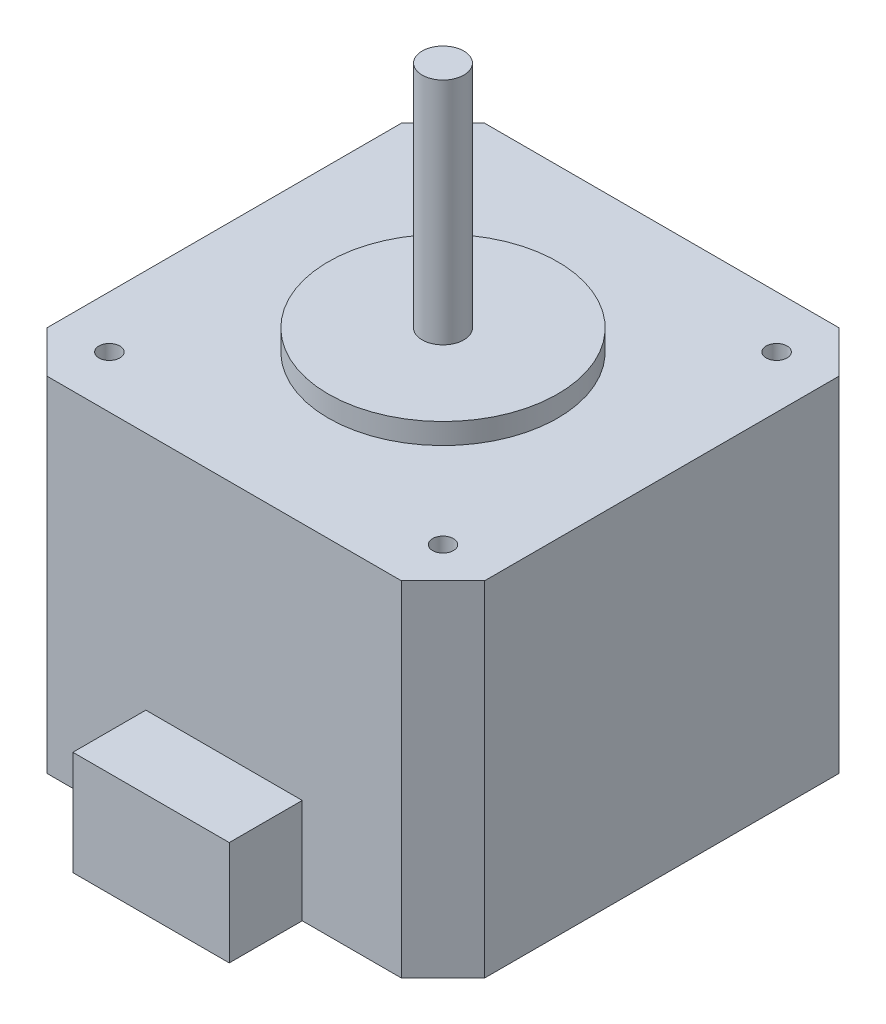
ISO-10303-21;
HEADER;
FILE_DESCRIPTION(('STEP AP214'),'2;1');
FILE_NAME('part.step','',(''),(''),'','','');
FILE_SCHEMA(('AUTOMOTIVE_DESIGN { 1 0 10303 214 1 1 1 1 }'));
ENDSEC;
DATA;
#1=APPLICATION_CONTEXT('core data for automotive mechanical design processes');
#2=APPLICATION_PROTOCOL_DEFINITION('international standard','automotive_design',2000,#1);
#3=PRODUCT_CONTEXT('',#1,'mechanical');
#4=PRODUCT('Part','Part','',(#3));
#5=PRODUCT_RELATED_PRODUCT_CATEGORY('part','',(#4));
#6=PRODUCT_DEFINITION_FORMATION('','',#4);
#7=PRODUCT_DEFINITION_CONTEXT('part definition',#1,'design');
#8=PRODUCT_DEFINITION('design','',#6,#7);
#9=PRODUCT_DEFINITION_SHAPE('','',#8);
#10=(LENGTH_UNIT() NAMED_UNIT(*) SI_UNIT(.MILLI.,.METRE.));
#11=(NAMED_UNIT(*) PLANE_ANGLE_UNIT() SI_UNIT($,.RADIAN.));
#12=(NAMED_UNIT(*) SI_UNIT($,.STERADIAN.) SOLID_ANGLE_UNIT());
#13=UNCERTAINTY_MEASURE_WITH_UNIT(LENGTH_MEASURE(1.E-05),#10,'distance_accuracy_value','');
#14=(GEOMETRIC_REPRESENTATION_CONTEXT(3) GLOBAL_UNCERTAINTY_ASSIGNED_CONTEXT((#13)) GLOBAL_UNIT_ASSIGNED_CONTEXT((#10,
#11,#12)) REPRESENTATION_CONTEXT('',''));
#15=CARTESIAN_POINT('',(0.,0.,0.));
#16=DIRECTION('',(0.,0.,1.));
#17=DIRECTION('',(1.,0.,0.));
#18=AXIS2_PLACEMENT_3D('',#15,#16,#17);
#19=CARTESIAN_POINT('',(0.,33.,42.));
#20=DIRECTION('',(0.,0.,-1.));
#21=DIRECTION('',(-1.,0.,0.));
#22=AXIS2_PLACEMENT_3D('',#19,#20,#21);
#23=PLANE('',#22);
#24=DIRECTION('',(1.,0.,0.));
#25=VECTOR('',#24,1.);
#26=CARTESIAN_POINT('',(0.,0.,42.));
#27=LINE('',#26,#25);
#28=CARTESIAN_POINT('',(28.5,0.,42.));
#29=VERTEX_POINT('',#28);
#30=CARTESIAN_POINT('',(38.,0.,42.));
#31=VERTEX_POINT('',#30);
#32=EDGE_CURVE('E224',#29,#31,#27,.T.);
#33=ORIENTED_EDGE('',*,*,#32,.T.);
#34=DIRECTION('',(0.,1.,0.));
#35=VECTOR('',#34,1.);
#36=CARTESIAN_POINT('',(38.,33.,42.));
#37=LINE('',#36,#35);
#38=CARTESIAN_POINT('',(38.,33.,42.));
#39=VERTEX_POINT('',#38);
#40=EDGE_CURVE('E246',#31,#39,#37,.T.);
#41=ORIENTED_EDGE('',*,*,#40,.T.);
#42=DIRECTION('',(1.,0.,0.));
#43=VECTOR('',#42,1.);
#44=CARTESIAN_POINT('',(0.,33.,42.));
#45=LINE('',#44,#43);
#46=CARTESIAN_POINT('',(4.,33.,42.));
#47=VERTEX_POINT('',#46);
#48=EDGE_CURVE('E215',#47,#39,#45,.T.);
#49=ORIENTED_EDGE('',*,*,#48,.F.);
#50=DIRECTION('',(0.,-1.,0.));
#51=VECTOR('',#50,1.);
#52=CARTESIAN_POINT('',(4.,33.,42.));
#53=LINE('',#52,#51);
#54=CARTESIAN_POINT('',(4.,0.,42.));
#55=VERTEX_POINT('',#54);
#56=EDGE_CURVE('E243',#47,#55,#53,.T.);
#57=ORIENTED_EDGE('',*,*,#56,.T.);
#58=CARTESIAN_POINT('',(13.5,0.,42.));
#59=VERTEX_POINT('',#58);
#60=EDGE_CURVE('E225',#55,#59,#27,.T.);
#61=ORIENTED_EDGE('',*,*,#60,.T.);
#62=DIRECTION('',(0.,-1.,0.));
#63=VECTOR('',#62,1.);
#64=CARTESIAN_POINT('',(13.5,0.,42.));
#65=LINE('',#64,#63);
#66=CARTESIAN_POINT('',(13.5,10.,42.));
#67=VERTEX_POINT('',#66);
#68=EDGE_CURVE('E167',#67,#59,#65,.T.);
#69=ORIENTED_EDGE('',*,*,#68,.F.);
#70=DIRECTION('',(-1.,0.,0.));
#71=VECTOR('',#70,1.);
#72=CARTESIAN_POINT('',(13.5,10.,42.));
#73=LINE('',#72,#71);
#74=CARTESIAN_POINT('',(28.5,10.,42.));
#75=VERTEX_POINT('',#74);
#76=EDGE_CURVE('E172',#75,#67,#73,.T.);
#77=ORIENTED_EDGE('',*,*,#76,.F.);
#78=DIRECTION('',(0.,1.,0.));
#79=VECTOR('',#78,1.);
#80=CARTESIAN_POINT('',(28.5,0.,42.));
#81=LINE('',#80,#79);
#82=EDGE_CURVE('E181',#29,#75,#81,.T.);
#83=ORIENTED_EDGE('',*,*,#82,.F.);
#84=EDGE_LOOP('',(#33,#41,#49,#57,#61,#69,#77,#83));
#85=FACE_BOUND('',#84,.T.);
#86=ADVANCED_FACE('F35',(#85),#23,.F.);
#87=CARTESIAN_POINT('',(0.,33.,0.));
#88=DIRECTION('',(1.,0.,0.));
#89=DIRECTION('',(0.,0.,-1.));
#90=AXIS2_PLACEMENT_3D('',#87,#88,#89);
#91=PLANE('',#90);
#92=DIRECTION('',(0.,0.,1.));
#93=VECTOR('',#92,1.);
#94=CARTESIAN_POINT('',(0.,0.,0.));
#95=LINE('',#94,#93);
#96=CARTESIAN_POINT('',(0.,0.,4.));
#97=VERTEX_POINT('',#96);
#98=CARTESIAN_POINT('',(0.,0.,38.));
#99=VERTEX_POINT('',#98);
#100=EDGE_CURVE('E208',#97,#99,#95,.T.);
#101=ORIENTED_EDGE('',*,*,#100,.T.);
#102=DIRECTION('',(0.,1.,0.));
#103=VECTOR('',#102,1.);
#104=CARTESIAN_POINT('',(0.,33.,38.));
#105=LINE('',#104,#103);
#106=CARTESIAN_POINT('',(0.,33.,38.));
#107=VERTEX_POINT('',#106);
#108=EDGE_CURVE('E258',#99,#107,#105,.T.);
#109=ORIENTED_EDGE('',*,*,#108,.T.);
#110=DIRECTION('',(0.,0.,1.));
#111=VECTOR('',#110,1.);
#112=CARTESIAN_POINT('',(0.,33.,0.));
#113=LINE('',#112,#111);
#114=CARTESIAN_POINT('',(0.,33.,4.));
#115=VERTEX_POINT('',#114);
#116=EDGE_CURVE('E212',#115,#107,#113,.T.);
#117=ORIENTED_EDGE('',*,*,#116,.F.);
#118=DIRECTION('',(0.,-1.,0.));
#119=VECTOR('',#118,1.);
#120=CARTESIAN_POINT('',(0.,33.,4.));
#121=LINE('',#120,#119);
#122=EDGE_CURVE('E255',#115,#97,#121,.T.);
#123=ORIENTED_EDGE('',*,*,#122,.T.);
#124=EDGE_LOOP('',(#101,#109,#117,#123));
#125=FACE_BOUND('',#124,.T.);
#126=ADVANCED_FACE('F274',(#125),#91,.F.);
#127=CARTESIAN_POINT('',(42.,33.,0.));
#128=DIRECTION('',(-1.,0.,0.));
#129=DIRECTION('',(0.,0.,1.));
#130=AXIS2_PLACEMENT_3D('',#127,#128,#129);
#131=PLANE('',#130);
#132=DIRECTION('',(0.,0.,-1.));
#133=VECTOR('',#132,1.);
#134=CARTESIAN_POINT('',(42.,33.,0.));
#135=LINE('',#134,#133);
#136=CARTESIAN_POINT('',(42.,33.,38.));
#137=VERTEX_POINT('',#136);
#138=CARTESIAN_POINT('',(42.,33.,4.00000000000003));
#139=VERTEX_POINT('',#138);
#140=EDGE_CURVE('E219',#137,#139,#135,.T.);
#141=ORIENTED_EDGE('',*,*,#140,.F.);
#142=DIRECTION('',(0.,-1.,0.));
#143=VECTOR('',#142,1.);
#144=CARTESIAN_POINT('',(42.,33.,38.));
#145=LINE('',#144,#143);
#146=CARTESIAN_POINT('',(42.,0.,38.));
#147=VERTEX_POINT('',#146);
#148=EDGE_CURVE('E232',#137,#147,#145,.T.);
#149=ORIENTED_EDGE('',*,*,#148,.T.);
#150=DIRECTION('',(0.,0.,-1.));
#151=VECTOR('',#150,1.);
#152=CARTESIAN_POINT('',(42.,0.,0.));
#153=LINE('',#152,#151);
#154=CARTESIAN_POINT('',(42.,0.,4.00000000000003));
#155=VERTEX_POINT('',#154);
#156=EDGE_CURVE('E227',#147,#155,#153,.T.);
#157=ORIENTED_EDGE('',*,*,#156,.T.);
#158=DIRECTION('',(0.,1.,0.));
#159=VECTOR('',#158,1.);
#160=CARTESIAN_POINT('',(42.,33.,4.00000000000003));
#161=LINE('',#160,#159);
#162=EDGE_CURVE('E204',#155,#139,#161,.T.);
#163=ORIENTED_EDGE('',*,*,#162,.T.);
#164=EDGE_LOOP('',(#141,#149,#157,#163));
#165=FACE_BOUND('',#164,.T.);
#166=ADVANCED_FACE('F306',(#165),#131,.F.);
#167=CARTESIAN_POINT('',(0.,33.,0.));
#168=DIRECTION('',(0.,0.,1.));
#169=DIRECTION('',(1.,0.,0.));
#170=AXIS2_PLACEMENT_3D('',#167,#168,#169);
#171=PLANE('',#170);
#172=DIRECTION('',(-1.,0.,0.));
#173=VECTOR('',#172,1.);
#174=CARTESIAN_POINT('',(0.,0.,0.));
#175=LINE('',#174,#173);
#176=CARTESIAN_POINT('',(38.,0.,0.));
#177=VERTEX_POINT('',#176);
#178=CARTESIAN_POINT('',(4.00000000000002,0.,0.));
#179=VERTEX_POINT('',#178);
#180=EDGE_CURVE('E216',#177,#179,#175,.T.);
#181=ORIENTED_EDGE('',*,*,#180,.T.);
#182=DIRECTION('',(0.,1.,0.));
#183=VECTOR('',#182,1.);
#184=CARTESIAN_POINT('',(4.00000000000002,33.,0.));
#185=LINE('',#184,#183);
#186=CARTESIAN_POINT('',(4.00000000000002,33.,0.));
#187=VERTEX_POINT('',#186);
#188=EDGE_CURVE('E11',#179,#187,#185,.T.);
#189=ORIENTED_EDGE('',*,*,#188,.T.);
#190=DIRECTION('',(-1.,0.,0.));
#191=VECTOR('',#190,1.);
#192=CARTESIAN_POINT('',(0.,33.,0.));
#193=LINE('',#192,#191);
#194=CARTESIAN_POINT('',(38.,33.,0.));
#195=VERTEX_POINT('',#194);
#196=EDGE_CURVE('E211',#195,#187,#193,.T.);
#197=ORIENTED_EDGE('',*,*,#196,.F.);
#198=DIRECTION('',(0.,-1.,0.));
#199=VECTOR('',#198,1.);
#200=CARTESIAN_POINT('',(38.,33.,0.));
#201=LINE('',#200,#199);
#202=EDGE_CURVE('E43',#195,#177,#201,.T.);
#203=ORIENTED_EDGE('',*,*,#202,.T.);
#204=EDGE_LOOP('',(#181,#189,#197,#203));
#205=FACE_BOUND('',#204,.T.);
#206=ADVANCED_FACE('F262',(#205),#171,.F.);
#207=CARTESIAN_POINT('',(0.,33.,0.));
#208=DIRECTION('',(0.,1.,0.));
#209=DIRECTION('',(0.,0.,1.));
#210=AXIS2_PLACEMENT_3D('',#207,#208,#209);
#211=PLANE('',#210);
#212=CARTESIAN_POINT('',(37.,33.,5.));
#213=DIRECTION('',(0.,1.,0.));
#214=DIRECTION('',(0.,0.,1.));
#215=AXIS2_PLACEMENT_3D('',#212,#213,#214);
#216=CIRCLE('',#215,0.999999999999994);
#217=CARTESIAN_POINT('',(37.,33.,5.99999999999999));
#218=VERTEX_POINT('',#217);
#219=EDGE_CURVE('E145',#218,#218,#216,.T.);
#220=ORIENTED_EDGE('',*,*,#219,.F.);
#221=EDGE_LOOP('',(#220));
#222=FACE_BOUND('',#221,.T.);
#223=CARTESIAN_POINT('',(37.,33.,37.));
#224=DIRECTION('',(0.,1.,0.));
#225=DIRECTION('',(0.,0.,1.));
#226=AXIS2_PLACEMENT_3D('',#223,#224,#225);
#227=CIRCLE('',#226,0.999999999999994);
#228=CARTESIAN_POINT('',(37.,33.,38.));
#229=VERTEX_POINT('',#228);
#230=EDGE_CURVE('E144',#229,#229,#227,.T.);
#231=ORIENTED_EDGE('',*,*,#230,.F.);
#232=EDGE_LOOP('',(#231));
#233=FACE_BOUND('',#232,.T.);
#234=CARTESIAN_POINT('',(5.00000000000001,33.,37.));
#235=DIRECTION('',(0.,1.,0.));
#236=DIRECTION('',(0.,0.,1.));
#237=AXIS2_PLACEMENT_3D('',#234,#235,#236);
#238=CIRCLE('',#237,0.999999999999997);
#239=CARTESIAN_POINT('',(5.00000000000001,33.,38.));
#240=VERTEX_POINT('',#239);
#241=EDGE_CURVE('E155',#240,#240,#238,.T.);
#242=ORIENTED_EDGE('',*,*,#241,.F.);
#243=EDGE_LOOP('',(#242));
#244=FACE_BOUND('',#243,.T.);
#245=CARTESIAN_POINT('',(5.,33.,5.));
#246=DIRECTION('',(0.,1.,0.));
#247=DIRECTION('',(0.,0.,1.));
#248=AXIS2_PLACEMENT_3D('',#245,#246,#247);
#249=CIRCLE('',#248,0.999999999999997);
#250=CARTESIAN_POINT('',(5.,33.,6.));
#251=VERTEX_POINT('',#250);
#252=EDGE_CURVE('E161',#251,#251,#249,.T.);
#253=ORIENTED_EDGE('',*,*,#252,.F.);
#254=EDGE_LOOP('',(#253));
#255=FACE_BOUND('',#254,.T.);
#256=CARTESIAN_POINT('',(21.,33.,21.));
#257=DIRECTION('',(0.,1.,0.));
#258=DIRECTION('',(0.,0.,1.));
#259=AXIS2_PLACEMENT_3D('',#256,#257,#258);
#260=CIRCLE('',#259,11.);
#261=CARTESIAN_POINT('',(21.,33.,32.));
#262=VERTEX_POINT('',#261);
#263=EDGE_CURVE('E205',#262,#262,#260,.T.);
#264=ORIENTED_EDGE('',*,*,#263,.F.);
#265=EDGE_LOOP('',(#264));
#266=FACE_BOUND('',#265,.T.);
#267=ORIENTED_EDGE('',*,*,#48,.T.);
#268=DIRECTION('',(-0.707106781186549,0.,0.707106781186546));
#269=VECTOR('',#268,1.);
#270=CARTESIAN_POINT('',(39.9999999999999,33.,40.0000000000001));
#271=LINE('',#270,#269);
#272=EDGE_CURVE('E253',#39,#137,#271,.F.);
#273=ORIENTED_EDGE('',*,*,#272,.T.);
#274=ORIENTED_EDGE('',*,*,#140,.T.);
#275=DIRECTION('',(0.707106781186546,0.,0.707106781186549));
#276=VECTOR('',#275,1.);
#277=CARTESIAN_POINT('',(19.0000000000001,33.,-19.));
#278=LINE('',#277,#276);
#279=EDGE_CURVE('E55',#139,#195,#278,.F.);
#280=ORIENTED_EDGE('',*,*,#279,.T.);
#281=ORIENTED_EDGE('',*,*,#196,.T.);
#282=DIRECTION('',(0.707106781186549,0.,-0.707106781186546));
#283=VECTOR('',#282,1.);
#284=CARTESIAN_POINT('',(2.,33.,2.00000000000001));
#285=LINE('',#284,#283);
#286=EDGE_CURVE('E249',#187,#115,#285,.F.);
#287=ORIENTED_EDGE('',*,*,#286,.T.);
#288=ORIENTED_EDGE('',*,*,#116,.T.);
#289=DIRECTION('',(-0.707106781186546,0.,-0.707106781186549));
#290=VECTOR('',#289,1.);
#291=CARTESIAN_POINT('',(-19.,33.,18.9999999999999));
#292=LINE('',#291,#290);
#293=EDGE_CURVE('E251',#107,#47,#292,.F.);
#294=ORIENTED_EDGE('',*,*,#293,.T.);
#295=EDGE_LOOP('',(#267,#273,#274,#280,#281,#287,#288,#294));
#296=FACE_BOUND('',#295,.T.);
#297=ADVANCED_FACE('F277',(#222,#233,#244,#255,#266,#296),#211,.T.);
#298=CARTESIAN_POINT('',(0.,0.,0.));
#299=DIRECTION('',(0.,1.,0.));
#300=DIRECTION('',(0.,0.,1.));
#301=AXIS2_PLACEMENT_3D('',#298,#299,#300);
#302=PLANE('',#301);
#303=ORIENTED_EDGE('',*,*,#156,.F.);
#304=DIRECTION('',(0.707106781186549,0.,-0.707106781186546));
#305=VECTOR('',#304,1.);
#306=CARTESIAN_POINT('',(42.,0.,38.));
#307=LINE('',#306,#305);
#308=EDGE_CURVE('E241',#147,#31,#307,.F.);
#309=ORIENTED_EDGE('',*,*,#308,.T.);
#310=ORIENTED_EDGE('',*,*,#32,.F.);
#311=DIRECTION('',(0.,0.,-1.));
#312=VECTOR('',#311,1.);
#313=CARTESIAN_POINT('',(28.5,0.,49.));
#314=LINE('',#313,#312);
#315=CARTESIAN_POINT('',(28.5,0.,49.));
#316=VERTEX_POINT('',#315);
#317=EDGE_CURVE('E191',#316,#29,#314,.T.);
#318=ORIENTED_EDGE('',*,*,#317,.F.);
#319=DIRECTION('',(1.,0.,0.));
#320=VECTOR('',#319,1.);
#321=CARTESIAN_POINT('',(13.5,0.,49.));
#322=LINE('',#321,#320);
#323=CARTESIAN_POINT('',(13.5,0.,49.));
#324=VERTEX_POINT('',#323);
#325=EDGE_CURVE('E171',#324,#316,#322,.T.);
#326=ORIENTED_EDGE('',*,*,#325,.F.);
#327=DIRECTION('',(0.,0.,-1.));
#328=VECTOR('',#327,1.);
#329=CARTESIAN_POINT('',(13.5,0.,49.));
#330=LINE('',#329,#328);
#331=EDGE_CURVE('E194',#324,#59,#330,.T.);
#332=ORIENTED_EDGE('',*,*,#331,.T.);
#333=ORIENTED_EDGE('',*,*,#60,.F.);
#334=DIRECTION('',(0.707106781186546,0.,0.707106781186549));
#335=VECTOR('',#334,1.);
#336=CARTESIAN_POINT('',(4.,0.,42.));
#337=LINE('',#336,#335);
#338=EDGE_CURVE('E239',#55,#99,#337,.F.);
#339=ORIENTED_EDGE('',*,*,#338,.T.);
#340=ORIENTED_EDGE('',*,*,#100,.F.);
#341=DIRECTION('',(-0.707106781186549,0.,0.707106781186546));
#342=VECTOR('',#341,1.);
#343=CARTESIAN_POINT('',(0.,0.,4.));
#344=LINE('',#343,#342);
#345=EDGE_CURVE('E237',#97,#179,#344,.F.);
#346=ORIENTED_EDGE('',*,*,#345,.T.);
#347=ORIENTED_EDGE('',*,*,#180,.F.);
#348=DIRECTION('',(-0.707106781186546,0.,-0.707106781186549));
#349=VECTOR('',#348,1.);
#350=CARTESIAN_POINT('',(38.,0.,0.));
#351=LINE('',#350,#349);
#352=EDGE_CURVE('E235',#177,#155,#351,.F.);
#353=ORIENTED_EDGE('',*,*,#352,.T.);
#354=EDGE_LOOP('',(#303,#309,#310,#318,#326,#332,#333,#339,#340,#346,#347,#353));
#355=FACE_BOUND('',#354,.T.);
#356=ADVANCED_FACE('F266',(#355),#302,.F.);
#357=CARTESIAN_POINT('',(21.,35.,21.));
#358=DIRECTION('',(0.,-1.,0.));
#359=DIRECTION('',(0.,0.,-1.));
#360=AXIS2_PLACEMENT_3D('',#357,#358,#359);
#361=CYLINDRICAL_SURFACE('',#360,11.);
#362=CARTESIAN_POINT('',(21.,35.,21.));
#363=DIRECTION('',(0.,1.,0.));
#364=DIRECTION('',(0.,0.,1.));
#365=AXIS2_PLACEMENT_3D('',#362,#363,#364);
#366=CIRCLE('',#365,11.);
#367=CARTESIAN_POINT('',(21.,35.,32.));
#368=VERTEX_POINT('',#367);
#369=EDGE_CURVE('E200',#368,#368,#366,.T.);
#370=ORIENTED_EDGE('',*,*,#369,.F.);
#371=EDGE_LOOP('',(#370));
#372=FACE_BOUND('',#371,.T.);
#373=ORIENTED_EDGE('',*,*,#263,.T.);
#374=EDGE_LOOP('',(#373));
#375=FACE_BOUND('',#374,.T.);
#376=ADVANCED_FACE('F450',(#372,#375),#361,.T.);
#377=CARTESIAN_POINT('',(21.,35.,21.));
#378=DIRECTION('',(0.,1.,0.));
#379=DIRECTION('',(0.,0.,1.));
#380=AXIS2_PLACEMENT_3D('',#377,#378,#379);
#381=PLANE('',#380);
#382=CARTESIAN_POINT('',(21.,35.,21.));
#383=DIRECTION('',(0.,1.,0.));
#384=DIRECTION('',(0.,0.,1.));
#385=AXIS2_PLACEMENT_3D('',#382,#383,#384);
#386=CIRCLE('',#385,2.);
#387=CARTESIAN_POINT('',(21.,35.,23.));
#388=VERTEX_POINT('',#387);
#389=EDGE_CURVE('E201',#388,#388,#386,.T.);
#390=ORIENTED_EDGE('',*,*,#389,.F.);
#391=EDGE_LOOP('',(#390));
#392=FACE_BOUND('',#391,.T.);
#393=ORIENTED_EDGE('',*,*,#369,.T.);
#394=EDGE_LOOP('',(#393));
#395=FACE_BOUND('',#394,.T.);
#396=ADVANCED_FACE('F476',(#392,#395),#381,.T.);
#397=CARTESIAN_POINT('',(21.,57.,21.));
#398=DIRECTION('',(0.,-1.,0.));
#399=DIRECTION('',(0.,0.,-1.));
#400=AXIS2_PLACEMENT_3D('',#397,#398,#399);
#401=CYLINDRICAL_SURFACE('',#400,2.);
#402=CARTESIAN_POINT('',(21.,57.,21.));
#403=DIRECTION('',(0.,1.,0.));
#404=DIRECTION('',(0.,0.,1.));
#405=AXIS2_PLACEMENT_3D('',#402,#403,#404);
#406=CIRCLE('',#405,2.);
#407=CARTESIAN_POINT('',(21.,57.,23.));
#408=VERTEX_POINT('',#407);
#409=EDGE_CURVE('E197',#408,#408,#406,.T.);
#410=ORIENTED_EDGE('',*,*,#409,.F.);
#411=EDGE_LOOP('',(#410));
#412=FACE_BOUND('',#411,.T.);
#413=ORIENTED_EDGE('',*,*,#389,.T.);
#414=EDGE_LOOP('',(#413));
#415=FACE_BOUND('',#414,.T.);
#416=ADVANCED_FACE('F467',(#412,#415),#401,.T.);
#417=CARTESIAN_POINT('',(21.,57.,21.));
#418=DIRECTION('',(0.,1.,0.));
#419=DIRECTION('',(0.,0.,1.));
#420=AXIS2_PLACEMENT_3D('',#417,#418,#419);
#421=PLANE('',#420);
#422=ORIENTED_EDGE('',*,*,#409,.T.);
#423=EDGE_LOOP('',(#422));
#424=FACE_BOUND('',#423,.T.);
#425=ADVANCED_FACE('F441',(#424),#421,.T.);
#426=CARTESIAN_POINT('',(13.5,0.,49.));
#427=DIRECTION('',(1.,0.,0.));
#428=DIRECTION('',(0.,0.,-1.));
#429=AXIS2_PLACEMENT_3D('',#426,#427,#428);
#430=PLANE('',#429);
#431=ORIENTED_EDGE('',*,*,#68,.T.);
#432=ORIENTED_EDGE('',*,*,#331,.F.);
#433=DIRECTION('',(0.,-1.,0.));
#434=VECTOR('',#433,1.);
#435=CARTESIAN_POINT('',(13.5,0.,49.));
#436=LINE('',#435,#434);
#437=CARTESIAN_POINT('',(13.5,10.,49.));
#438=VERTEX_POINT('',#437);
#439=EDGE_CURVE('E168',#438,#324,#436,.T.);
#440=ORIENTED_EDGE('',*,*,#439,.F.);
#441=DIRECTION('',(0.,0.,-1.));
#442=VECTOR('',#441,1.);
#443=CARTESIAN_POINT('',(13.5,10.,49.));
#444=LINE('',#443,#442);
#445=EDGE_CURVE('E178',#438,#67,#444,.T.);
#446=ORIENTED_EDGE('',*,*,#445,.T.);
#447=EDGE_LOOP('',(#431,#432,#440,#446));
#448=FACE_BOUND('',#447,.T.);
#449=ADVANCED_FACE('F289',(#448),#430,.F.);
#450=CARTESIAN_POINT('',(28.5,0.,49.));
#451=DIRECTION('',(-1.,0.,0.));
#452=DIRECTION('',(0.,0.,1.));
#453=AXIS2_PLACEMENT_3D('',#450,#451,#452);
#454=PLANE('',#453);
#455=ORIENTED_EDGE('',*,*,#82,.T.);
#456=DIRECTION('',(0.,0.,-1.));
#457=VECTOR('',#456,1.);
#458=CARTESIAN_POINT('',(28.5,10.,49.));
#459=LINE('',#458,#457);
#460=CARTESIAN_POINT('',(28.5,10.,49.));
#461=VERTEX_POINT('',#460);
#462=EDGE_CURVE('E188',#461,#75,#459,.T.);
#463=ORIENTED_EDGE('',*,*,#462,.F.);
#464=DIRECTION('',(0.,1.,0.));
#465=VECTOR('',#464,1.);
#466=CARTESIAN_POINT('',(28.5,0.,49.));
#467=LINE('',#466,#465);
#468=EDGE_CURVE('E174',#316,#461,#467,.T.);
#469=ORIENTED_EDGE('',*,*,#468,.F.);
#470=ORIENTED_EDGE('',*,*,#317,.T.);
#471=EDGE_LOOP('',(#455,#463,#469,#470));
#472=FACE_BOUND('',#471,.T.);
#473=ADVANCED_FACE('F297',(#472),#454,.F.);
#474=CARTESIAN_POINT('',(13.5,10.,49.));
#475=DIRECTION('',(0.,-1.,0.));
#476=DIRECTION('',(0.,0.,-1.));
#477=AXIS2_PLACEMENT_3D('',#474,#475,#476);
#478=PLANE('',#477);
#479=ORIENTED_EDGE('',*,*,#76,.T.);
#480=ORIENTED_EDGE('',*,*,#445,.F.);
#481=DIRECTION('',(-1.,0.,0.));
#482=VECTOR('',#481,1.);
#483=CARTESIAN_POINT('',(13.5,10.,49.));
#484=LINE('',#483,#482);
#485=EDGE_CURVE('E176',#461,#438,#484,.T.);
#486=ORIENTED_EDGE('',*,*,#485,.F.);
#487=ORIENTED_EDGE('',*,*,#462,.T.);
#488=EDGE_LOOP('',(#479,#480,#486,#487));
#489=FACE_BOUND('',#488,.T.);
#490=ADVANCED_FACE('F292',(#489),#478,.F.);
#491=CARTESIAN_POINT('',(0.,0.,49.));
#492=DIRECTION('',(0.,0.,-1.));
#493=DIRECTION('',(-1.,0.,0.));
#494=AXIS2_PLACEMENT_3D('',#491,#492,#493);
#495=PLANE('',#494);
#496=ORIENTED_EDGE('',*,*,#439,.T.);
#497=ORIENTED_EDGE('',*,*,#325,.T.);
#498=ORIENTED_EDGE('',*,*,#468,.T.);
#499=ORIENTED_EDGE('',*,*,#485,.T.);
#500=EDGE_LOOP('',(#496,#497,#498,#499));
#501=FACE_BOUND('',#500,.T.);
#502=ADVANCED_FACE('F410',(#501),#495,.F.);
#503=CARTESIAN_POINT('',(5.,25.,5.));
#504=DIRECTION('',(0.,1.,0.));
#505=DIRECTION('',(0.,0.,1.));
#506=AXIS2_PLACEMENT_3D('',#503,#504,#505);
#507=CONICAL_SURFACE('',#506,0.999999999999996,1.02974425867665);
#508=CARTESIAN_POINT('',(5.,24.3991393809724,5.));
#509=VERTEX_POINT('',#508);
#510=VERTEX_LOOP('',#509);
#511=FACE_BOUND('',#510,.T.);
#512=CARTESIAN_POINT('',(5.,25.,5.));
#513=DIRECTION('',(0.,1.,0.));
#514=DIRECTION('',(0.,0.,1.));
#515=AXIS2_PLACEMENT_3D('',#512,#513,#514);
#516=CIRCLE('',#515,0.999999999999996);
#517=CARTESIAN_POINT('',(5.,25.,6.));
#518=VERTEX_POINT('',#517);
#519=EDGE_CURVE('E164',#518,#518,#516,.T.);
#520=ORIENTED_EDGE('',*,*,#519,.T.);
#521=EDGE_LOOP('',(#520));
#522=FACE_BOUND('',#521,.T.);
#523=ADVANCED_FACE('F401',(#511,#522),#507,.F.);
#524=CARTESIAN_POINT('',(5.,33.,5.));
#525=DIRECTION('',(0.,1.,0.));
#526=DIRECTION('',(0.,0.,1.));
#527=AXIS2_PLACEMENT_3D('',#524,#525,#526);
#528=CYLINDRICAL_SURFACE('',#527,0.999999999999997);
#529=ORIENTED_EDGE('',*,*,#519,.F.);
#530=EDGE_LOOP('',(#529));
#531=FACE_BOUND('',#530,.T.);
#532=ORIENTED_EDGE('',*,*,#252,.T.);
#533=EDGE_LOOP('',(#532));
#534=FACE_BOUND('',#533,.T.);
#535=ADVANCED_FACE('F392',(#531,#534),#528,.F.);
#536=CARTESIAN_POINT('',(5.00000000000001,25.,37.));
#537=DIRECTION('',(0.,1.,0.));
#538=DIRECTION('',(0.,0.,1.));
#539=AXIS2_PLACEMENT_3D('',#536,#537,#538);
#540=CONICAL_SURFACE('',#539,0.999999999999997,1.02974425867665);
#541=CARTESIAN_POINT('',(5.,24.3991393809724,37.));
#542=VERTEX_POINT('',#541);
#543=VERTEX_LOOP('',#542);
#544=FACE_BOUND('',#543,.T.);
#545=CARTESIAN_POINT('',(5.00000000000001,25.,37.));
#546=DIRECTION('',(0.,1.,0.));
#547=DIRECTION('',(0.,0.,1.));
#548=AXIS2_PLACEMENT_3D('',#545,#546,#547);
#549=CIRCLE('',#548,0.999999999999997);
#550=CARTESIAN_POINT('',(5.00000000000001,25.,38.));
#551=VERTEX_POINT('',#550);
#552=EDGE_CURVE('E158',#551,#551,#549,.T.);
#553=ORIENTED_EDGE('',*,*,#552,.T.);
#554=EDGE_LOOP('',(#553));
#555=FACE_BOUND('',#554,.T.);
#556=ADVANCED_FACE('F383',(#544,#555),#540,.F.);
#557=CARTESIAN_POINT('',(5.00000000000001,33.,37.));
#558=DIRECTION('',(0.,1.,0.));
#559=DIRECTION('',(0.,0.,1.));
#560=AXIS2_PLACEMENT_3D('',#557,#558,#559);
#561=CYLINDRICAL_SURFACE('',#560,0.999999999999997);
#562=ORIENTED_EDGE('',*,*,#552,.F.);
#563=EDGE_LOOP('',(#562));
#564=FACE_BOUND('',#563,.T.);
#565=ORIENTED_EDGE('',*,*,#241,.T.);
#566=EDGE_LOOP('',(#565));
#567=FACE_BOUND('',#566,.T.);
#568=ADVANCED_FACE('F374',(#564,#567),#561,.F.);
#569=CARTESIAN_POINT('',(37.,25.,37.));
#570=DIRECTION('',(0.,1.,0.));
#571=DIRECTION('',(0.,0.,1.));
#572=AXIS2_PLACEMENT_3D('',#569,#570,#571);
#573=CONICAL_SURFACE('',#572,0.999999999999994,1.02974425867665);
#574=CARTESIAN_POINT('',(37.,24.3991393809724,37.));
#575=VERTEX_POINT('',#574);
#576=VERTEX_LOOP('',#575);
#577=FACE_BOUND('',#576,.T.);
#578=CARTESIAN_POINT('',(37.,25.,37.));
#579=DIRECTION('',(0.,1.,0.));
#580=DIRECTION('',(0.,0.,1.));
#581=AXIS2_PLACEMENT_3D('',#578,#579,#580);
#582=CIRCLE('',#581,0.999999999999994);
#583=CARTESIAN_POINT('',(37.,25.,38.));
#584=VERTEX_POINT('',#583);
#585=EDGE_CURVE('E148',#584,#584,#582,.T.);
#586=ORIENTED_EDGE('',*,*,#585,.T.);
#587=EDGE_LOOP('',(#586));
#588=FACE_BOUND('',#587,.T.);
#589=ADVANCED_FACE('F365',(#577,#588),#573,.F.);
#590=CARTESIAN_POINT('',(37.,33.,37.));
#591=DIRECTION('',(0.,1.,0.));
#592=DIRECTION('',(0.,0.,1.));
#593=AXIS2_PLACEMENT_3D('',#590,#591,#592);
#594=CYLINDRICAL_SURFACE('',#593,0.999999999999994);
#595=ORIENTED_EDGE('',*,*,#585,.F.);
#596=EDGE_LOOP('',(#595));
#597=FACE_BOUND('',#596,.T.);
#598=ORIENTED_EDGE('',*,*,#230,.T.);
#599=EDGE_LOOP('',(#598));
#600=FACE_BOUND('',#599,.T.);
#601=ADVANCED_FACE('F138',(#597,#600),#594,.F.);
#602=CARTESIAN_POINT('',(37.,25.,5.));
#603=DIRECTION('',(0.,1.,0.));
#604=DIRECTION('',(0.,0.,1.));
#605=AXIS2_PLACEMENT_3D('',#602,#603,#604);
#606=CONICAL_SURFACE('',#605,0.999999999999994,1.02974425867665);
#607=CARTESIAN_POINT('',(37.,24.3991393809724,5.));
#608=VERTEX_POINT('',#607);
#609=VERTEX_LOOP('',#608);
#610=FACE_BOUND('',#609,.T.);
#611=CARTESIAN_POINT('',(37.,25.,5.));
#612=DIRECTION('',(0.,1.,0.));
#613=DIRECTION('',(0.,0.,1.));
#614=AXIS2_PLACEMENT_3D('',#611,#612,#613);
#615=CIRCLE('',#614,0.999999999999994);
#616=CARTESIAN_POINT('',(37.,25.,5.99999999999999));
#617=VERTEX_POINT('',#616);
#618=EDGE_CURVE('E142',#617,#617,#615,.T.);
#619=ORIENTED_EDGE('',*,*,#618,.T.);
#620=EDGE_LOOP('',(#619));
#621=FACE_BOUND('',#620,.T.);
#622=ADVANCED_FACE('F134',(#610,#621),#606,.F.);
#623=CARTESIAN_POINT('',(37.,33.,5.));
#624=DIRECTION('',(0.,1.,0.));
#625=DIRECTION('',(0.,0.,1.));
#626=AXIS2_PLACEMENT_3D('',#623,#624,#625);
#627=CYLINDRICAL_SURFACE('',#626,0.999999999999994);
#628=ORIENTED_EDGE('',*,*,#618,.F.);
#629=EDGE_LOOP('',(#628));
#630=FACE_BOUND('',#629,.T.);
#631=ORIENTED_EDGE('',*,*,#219,.T.);
#632=EDGE_LOOP('',(#631));
#633=FACE_BOUND('',#632,.T.);
#634=ADVANCED_FACE('F137',(#630,#633),#627,.F.);
#635=CARTESIAN_POINT('',(42.,33.,38.));
#636=DIRECTION('',(-0.707106781186546,0.,-0.707106781186549));
#637=DIRECTION('',(0.,-1.,0.));
#638=AXIS2_PLACEMENT_3D('',#635,#636,#637);
#639=PLANE('',#638);
#640=ORIENTED_EDGE('',*,*,#272,.F.);
#641=ORIENTED_EDGE('',*,*,#40,.F.);
#642=ORIENTED_EDGE('',*,*,#308,.F.);
#643=ORIENTED_EDGE('',*,*,#148,.F.);
#644=EDGE_LOOP('',(#640,#641,#642,#643));
#645=FACE_BOUND('',#644,.T.);
#646=ADVANCED_FACE('F303',(#645),#639,.F.);
#647=CARTESIAN_POINT('',(4.,33.,42.));
#648=DIRECTION('',(0.707106781186549,0.,-0.707106781186546));
#649=DIRECTION('',(0.,-1.,0.));
#650=AXIS2_PLACEMENT_3D('',#647,#648,#649);
#651=PLANE('',#650);
#652=ORIENTED_EDGE('',*,*,#293,.F.);
#653=ORIENTED_EDGE('',*,*,#108,.F.);
#654=ORIENTED_EDGE('',*,*,#338,.F.);
#655=ORIENTED_EDGE('',*,*,#56,.F.);
#656=EDGE_LOOP('',(#652,#653,#654,#655));
#657=FACE_BOUND('',#656,.T.);
#658=ADVANCED_FACE('F281',(#657),#651,.F.);
#659=CARTESIAN_POINT('',(0.,33.,4.));
#660=DIRECTION('',(0.707106781186546,0.,0.707106781186549));
#661=DIRECTION('',(0.,-1.,0.));
#662=AXIS2_PLACEMENT_3D('',#659,#660,#661);
#663=PLANE('',#662);
#664=ORIENTED_EDGE('',*,*,#286,.F.);
#665=ORIENTED_EDGE('',*,*,#188,.F.);
#666=ORIENTED_EDGE('',*,*,#345,.F.);
#667=ORIENTED_EDGE('',*,*,#122,.F.);
#668=EDGE_LOOP('',(#664,#665,#666,#667));
#669=FACE_BOUND('',#668,.T.);
#670=ADVANCED_FACE('F271',(#669),#663,.F.);
#671=CARTESIAN_POINT('',(38.,33.,0.));
#672=DIRECTION('',(-0.707106781186549,0.,0.707106781186546));
#673=DIRECTION('',(0.,-1.,0.));
#674=AXIS2_PLACEMENT_3D('',#671,#672,#673);
#675=PLANE('',#674);
#676=ORIENTED_EDGE('',*,*,#279,.F.);
#677=ORIENTED_EDGE('',*,*,#162,.F.);
#678=ORIENTED_EDGE('',*,*,#352,.F.);
#679=ORIENTED_EDGE('',*,*,#202,.F.);
#680=EDGE_LOOP('',(#676,#677,#678,#679));
#681=FACE_BOUND('',#680,.T.);
#682=ADVANCED_FACE('F37',(#681),#675,.F.);
#683=CLOSED_SHELL('',(#86,#126,#166,#206,#297,#356,#376,#396,#416,#425,#449,#473,#490,#502,#523,
#535,#556,#568,#589,#601,#622,#634,#646,#658,#670,#682));
#684=MANIFOLD_SOLID_BREP('B2',#683);
#685=ADVANCED_BREP_SHAPE_REPRESENTATION('',(#18,#684),#14);
#686=SHAPE_DEFINITION_REPRESENTATION(#9,#685);
ENDSEC;
END-ISO-10303-21;
